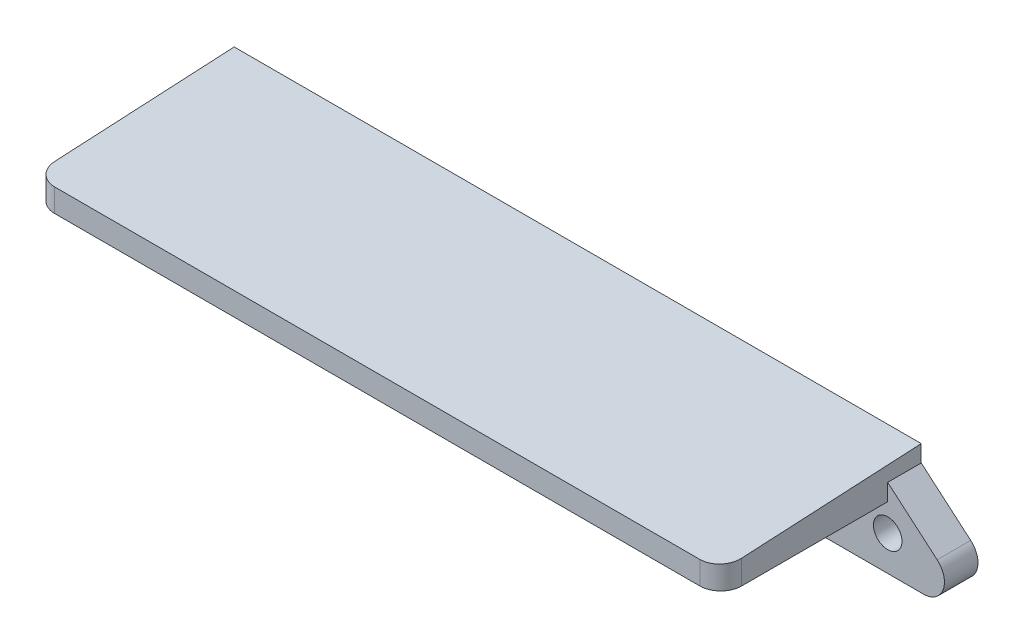
ISO-10303-21;
HEADER;
FILE_DESCRIPTION(('STEP AP214'),'2;1');
FILE_NAME('part.step','',(''),(''),'','','');
FILE_SCHEMA(('AUTOMOTIVE_DESIGN { 1 0 10303 214 1 1 1 1 }'));
ENDSEC;
DATA;
#1=APPLICATION_CONTEXT('core data for automotive mechanical design processes');
#2=APPLICATION_PROTOCOL_DEFINITION('international standard','automotive_design',2000,#1);
#3=PRODUCT_CONTEXT('',#1,'mechanical');
#4=PRODUCT('Part','Part','',(#3));
#5=PRODUCT_RELATED_PRODUCT_CATEGORY('part','',(#4));
#6=PRODUCT_DEFINITION_FORMATION('','',#4);
#7=PRODUCT_DEFINITION_CONTEXT('part definition',#1,'design');
#8=PRODUCT_DEFINITION('design','',#6,#7);
#9=PRODUCT_DEFINITION_SHAPE('','',#8);
#10=(LENGTH_UNIT() NAMED_UNIT(*) SI_UNIT(.MILLI.,.METRE.));
#11=(NAMED_UNIT(*) PLANE_ANGLE_UNIT() SI_UNIT($,.RADIAN.));
#12=(NAMED_UNIT(*) SI_UNIT($,.STERADIAN.) SOLID_ANGLE_UNIT());
#13=UNCERTAINTY_MEASURE_WITH_UNIT(LENGTH_MEASURE(1.E-05),#10,'distance_accuracy_value','');
#14=(GEOMETRIC_REPRESENTATION_CONTEXT(3) GLOBAL_UNCERTAINTY_ASSIGNED_CONTEXT((#13)) GLOBAL_UNIT_ASSIGNED_CONTEXT((#10,
#11,#12)) REPRESENTATION_CONTEXT('',''));
#15=CARTESIAN_POINT('',(0.,0.,0.));
#16=DIRECTION('',(0.,0.,1.));
#17=DIRECTION('',(1.,0.,0.));
#18=AXIS2_PLACEMENT_3D('',#15,#16,#17);
#19=CARTESIAN_POINT('',(40.95,11.4088057159238,4.));
#20=DIRECTION('',(-1.,0.,0.));
#21=DIRECTION('',(0.,-1.,0.));
#22=AXIS2_PLACEMENT_3D('',#19,#20,#21);
#23=PLANE('',#22);
#24=DIRECTION('',(0.,0.0523359562429439,-0.998629534754574));
#25=VECTOR('',#24,1.);
#26=CARTESIAN_POINT('',(40.95,11.4088057159238,0.));
#27=LINE('',#26,#25);
#28=CARTESIAN_POINT('',(40.95,10.2872792392667,21.4));
#29=VERTEX_POINT('',#28);
#30=CARTESIAN_POINT('',(40.95,11.4088057159238,0.));
#31=VERTEX_POINT('',#30);
#32=EDGE_CURVE('E130',#29,#31,#27,.T.);
#33=ORIENTED_EDGE('',*,*,#32,.F.);
#34=DIRECTION('',(0.,1.,0.));
#35=VECTOR('',#34,1.);
#36=CARTESIAN_POINT('',(40.95,7.40880571592377,21.4));
#37=LINE('',#36,#35);
#38=CARTESIAN_POINT('',(40.95,7.40880571592377,21.4));
#39=VERTEX_POINT('',#38);
#40=EDGE_CURVE('E202',#29,#39,#37,.F.);
#41=ORIENTED_EDGE('',*,*,#40,.T.);
#42=DIRECTION('',(0.,0.,-1.));
#43=VECTOR('',#42,1.);
#44=CARTESIAN_POINT('',(40.95,7.40880571592377,23.9));
#45=LINE('',#44,#43);
#46=CARTESIAN_POINT('',(40.95,7.40880571592377,4.));
#47=VERTEX_POINT('',#46);
#48=EDGE_CURVE('E230',#39,#47,#45,.T.);
#49=ORIENTED_EDGE('',*,*,#48,.T.);
#50=DIRECTION('',(0.,1.,0.));
#51=VECTOR('',#50,1.);
#52=CARTESIAN_POINT('',(40.95,11.4088057159238,4.));
#53=LINE('',#52,#51);
#54=CARTESIAN_POINT('',(40.95,9.40880571592378,4.));
#55=VERTEX_POINT('',#54);
#56=EDGE_CURVE('E231',#47,#55,#53,.T.);
#57=ORIENTED_EDGE('',*,*,#56,.T.);
#58=DIRECTION('',(0.,0.,-1.));
#59=VECTOR('',#58,1.);
#60=CARTESIAN_POINT('',(40.95,9.40880571592378,4.));
#61=LINE('',#60,#59);
#62=CARTESIAN_POINT('',(40.95,9.40880571592378,0.));
#63=VERTEX_POINT('',#62);
#64=EDGE_CURVE('E155',#55,#63,#61,.T.);
#65=ORIENTED_EDGE('',*,*,#64,.T.);
#66=DIRECTION('',(0.,-1.,0.));
#67=VECTOR('',#66,1.);
#68=CARTESIAN_POINT('',(40.95,11.4088057159238,0.));
#69=LINE('',#68,#67);
#70=EDGE_CURVE('E146',#31,#63,#69,.T.);
#71=ORIENTED_EDGE('',*,*,#70,.F.);
#72=EDGE_LOOP('',(#33,#41,#49,#57,#65,#71));
#73=FACE_BOUND('',#72,.T.);
#74=ADVANCED_FACE('F41',(#73),#23,.F.);
#75=CARTESIAN_POINT('',(-40.95,11.4088057159238,0.));
#76=DIRECTION('',(1.,0.,0.));
#77=DIRECTION('',(0.,1.,0.));
#78=AXIS2_PLACEMENT_3D('',#75,#76,#77);
#79=PLANE('',#78);
#80=DIRECTION('',(0.,-0.0523359562429439,0.998629534754574));
#81=VECTOR('',#80,1.);
#82=CARTESIAN_POINT('',(-40.95,11.4088057159238,0.));
#83=LINE('',#82,#81);
#84=CARTESIAN_POINT('',(-40.95,11.4088057159238,0.));
#85=VERTEX_POINT('',#84);
#86=CARTESIAN_POINT('',(-40.95,10.2872792392667,21.4));
#87=VERTEX_POINT('',#86);
#88=EDGE_CURVE('E58',#85,#87,#83,.T.);
#89=ORIENTED_EDGE('',*,*,#88,.F.);
#90=DIRECTION('',(0.,-1.,0.));
#91=VECTOR('',#90,1.);
#92=CARTESIAN_POINT('',(-40.95,11.4088057159238,0.));
#93=LINE('',#92,#91);
#94=CARTESIAN_POINT('',(-40.95,9.40880571592378,0.));
#95=VERTEX_POINT('',#94);
#96=EDGE_CURVE('E150',#85,#95,#93,.T.);
#97=ORIENTED_EDGE('',*,*,#96,.T.);
#98=DIRECTION('',(0.,0.,-1.));
#99=VECTOR('',#98,1.);
#100=CARTESIAN_POINT('',(-40.95,9.40880571592378,4.));
#101=LINE('',#100,#99);
#102=CARTESIAN_POINT('',(-40.95,9.40880571592378,4.));
#103=VERTEX_POINT('',#102);
#104=EDGE_CURVE('E170',#103,#95,#101,.T.);
#105=ORIENTED_EDGE('',*,*,#104,.F.);
#106=DIRECTION('',(0.,-1.,0.));
#107=VECTOR('',#106,1.);
#108=CARTESIAN_POINT('',(-40.95,11.4088057159238,4.));
#109=LINE('',#108,#107);
#110=CARTESIAN_POINT('',(-40.95,7.40880571592377,4.));
#111=VERTEX_POINT('',#110);
#112=EDGE_CURVE('E196',#103,#111,#109,.T.);
#113=ORIENTED_EDGE('',*,*,#112,.T.);
#114=DIRECTION('',(0.,0.,-1.));
#115=VECTOR('',#114,1.);
#116=CARTESIAN_POINT('',(-40.95,7.40880571592377,23.9));
#117=LINE('',#116,#115);
#118=CARTESIAN_POINT('',(-40.95,7.40880571592377,21.4));
#119=VERTEX_POINT('',#118);
#120=EDGE_CURVE('E151',#119,#111,#117,.T.);
#121=ORIENTED_EDGE('',*,*,#120,.F.);
#122=DIRECTION('',(0.,-1.,0.));
#123=VECTOR('',#122,1.);
#124=CARTESIAN_POINT('',(-40.95,11.4088057159238,21.4));
#125=LINE('',#124,#123);
#126=EDGE_CURVE('E50',#119,#87,#125,.F.);
#127=ORIENTED_EDGE('',*,*,#126,.T.);
#128=EDGE_LOOP('',(#89,#97,#105,#113,#121,#127));
#129=FACE_BOUND('',#128,.T.);
#130=ADVANCED_FACE('F248',(#129),#79,.F.);
#131=CARTESIAN_POINT('',(0.,0.,23.9));
#132=DIRECTION('',(0.,0.,1.));
#133=DIRECTION('',(1.,0.,0.));
#134=AXIS2_PLACEMENT_3D('',#131,#132,#133);
#135=PLANE('',#134);
#136=DIRECTION('',(0.,1.,0.));
#137=VECTOR('',#136,1.);
#138=CARTESIAN_POINT('',(38.45,11.4088057159238,23.9));
#139=LINE('',#138,#137);
#140=CARTESIAN_POINT('',(38.45,7.40880571592377,23.9));
#141=VERTEX_POINT('',#140);
#142=CARTESIAN_POINT('',(38.45,10.1562597910591,23.9));
#143=VERTEX_POINT('',#142);
#144=EDGE_CURVE('E199',#141,#143,#139,.T.);
#145=ORIENTED_EDGE('',*,*,#144,.T.);
#146=DIRECTION('',(-1.,0.,0.));
#147=VECTOR('',#146,1.);
#148=CARTESIAN_POINT('',(0.,10.1562597910591,23.9));
#149=LINE('',#148,#147);
#150=CARTESIAN_POINT('',(-38.45,10.1562597910591,23.9));
#151=VERTEX_POINT('',#150);
#152=EDGE_CURVE('E139',#143,#151,#149,.T.);
#153=ORIENTED_EDGE('',*,*,#152,.T.);
#154=DIRECTION('',(0.,-1.,0.));
#155=VECTOR('',#154,1.);
#156=CARTESIAN_POINT('',(-38.45,7.40880571592377,23.9));
#157=LINE('',#156,#155);
#158=CARTESIAN_POINT('',(-38.45,7.40880571592377,23.9));
#159=VERTEX_POINT('',#158);
#160=EDGE_CURVE('E197',#151,#159,#157,.T.);
#161=ORIENTED_EDGE('',*,*,#160,.T.);
#162=DIRECTION('',(1.,0.,0.));
#163=VECTOR('',#162,1.);
#164=CARTESIAN_POINT('',(-40.95,7.40880571592377,23.9));
#165=LINE('',#164,#163);
#166=EDGE_CURVE('E227',#159,#141,#165,.T.);
#167=ORIENTED_EDGE('',*,*,#166,.T.);
#168=EDGE_LOOP('',(#145,#153,#161,#167));
#169=FACE_BOUND('',#168,.T.);
#170=ADVANCED_FACE('F273',(#169),#135,.T.);
#171=CARTESIAN_POINT('',(38.45,0.,21.4));
#172=DIRECTION('',(0.,-1.,0.));
#173=DIRECTION('',(1.,0.,0.));
#174=AXIS2_PLACEMENT_3D('',#171,#172,#173);
#175=CYLINDRICAL_SURFACE('',#174,2.5);
#176=ORIENTED_EDGE('',*,*,#40,.F.);
#177=CARTESIAN_POINT('',(38.45,10.2872792392667,21.4));
#178=DIRECTION('',(0.,0.998629534754574,0.0523359562429439));
#179=DIRECTION('',(0.,-0.052335956242944,0.998629534754574));
#180=AXIS2_PLACEMENT_3D('',#177,#178,#179);
#181=ELLIPSE('',#180,2.5034308649948,2.5);
#182=EDGE_CURVE('E135',#29,#143,#181,.F.);
#183=ORIENTED_EDGE('',*,*,#182,.T.);
#184=ORIENTED_EDGE('',*,*,#144,.F.);
#185=CARTESIAN_POINT('',(38.45,7.40880571592377,21.4));
#186=DIRECTION('',(0.,1.,0.));
#187=DIRECTION('',(0.,0.,1.));
#188=AXIS2_PLACEMENT_3D('',#185,#186,#187);
#189=CIRCLE('',#188,2.5);
#190=EDGE_CURVE('E205',#39,#141,#189,.F.);
#191=ORIENTED_EDGE('',*,*,#190,.F.);
#192=EDGE_LOOP('',(#176,#183,#184,#191));
#193=FACE_BOUND('',#192,.T.);
#194=ADVANCED_FACE('F271',(#193),#175,.T.);
#195=CARTESIAN_POINT('',(-38.45,0.,21.4));
#196=DIRECTION('',(0.,1.,0.));
#197=DIRECTION('',(-1.,0.,0.));
#198=AXIS2_PLACEMENT_3D('',#195,#196,#197);
#199=CYLINDRICAL_SURFACE('',#198,2.5);
#200=ORIENTED_EDGE('',*,*,#160,.F.);
#201=CARTESIAN_POINT('',(-38.45,10.2872792392667,21.4));
#202=DIRECTION('',(0.,0.998629534754574,0.0523359562429439));
#203=DIRECTION('',(0.,0.052335956242944,-0.998629534754574));
#204=AXIS2_PLACEMENT_3D('',#201,#202,#203);
#205=ELLIPSE('',#204,2.5034308649948,2.5);
#206=EDGE_CURVE('E11',#151,#87,#205,.F.);
#207=ORIENTED_EDGE('',*,*,#206,.T.);
#208=ORIENTED_EDGE('',*,*,#126,.F.);
#209=CARTESIAN_POINT('',(-38.45,7.40880571592377,21.4));
#210=DIRECTION('',(0.,1.,0.));
#211=DIRECTION('',(0.,0.,1.));
#212=AXIS2_PLACEMENT_3D('',#209,#210,#211);
#213=CIRCLE('',#212,2.5);
#214=EDGE_CURVE('E65',#159,#119,#213,.F.);
#215=ORIENTED_EDGE('',*,*,#214,.F.);
#216=EDGE_LOOP('',(#200,#207,#208,#215));
#217=FACE_BOUND('',#216,.T.);
#218=ADVANCED_FACE('F43',(#217),#199,.T.);
#219=CARTESIAN_POINT('',(0.,0.,4.));
#220=DIRECTION('',(0.,0.,-1.));
#221=DIRECTION('',(-1.,0.,0.));
#222=AXIS2_PLACEMENT_3D('',#219,#220,#221);
#223=PLANE('',#222);
#224=CARTESIAN_POINT('',(40.95,4.15880571592378,4.));
#225=DIRECTION('',(0.,0.,-1.));
#226=DIRECTION('',(-1.,0.,0.));
#227=AXIS2_PLACEMENT_3D('',#224,#225,#226);
#228=CIRCLE('',#227,1.7);
#229=CARTESIAN_POINT('',(39.25,4.15880571592378,4.));
#230=VERTEX_POINT('',#229);
#231=EDGE_CURVE('E45',#230,#230,#228,.T.);
#232=ORIENTED_EDGE('',*,*,#231,.T.);
#233=EDGE_LOOP('',(#232));
#234=FACE_BOUND('',#233,.T.);
#235=CARTESIAN_POINT('',(-40.95,4.15880571592378,4.));
#236=DIRECTION('',(0.,0.,-1.));
#237=DIRECTION('',(-1.,0.,0.));
#238=AXIS2_PLACEMENT_3D('',#235,#236,#237);
#239=CIRCLE('',#238,1.7);
#240=CARTESIAN_POINT('',(-42.65,4.15880571592378,4.));
#241=VERTEX_POINT('',#240);
#242=EDGE_CURVE('E208',#241,#241,#239,.T.);
#243=ORIENTED_EDGE('',*,*,#242,.T.);
#244=EDGE_LOOP('',(#243));
#245=FACE_BOUND('',#244,.T.);
#246=ORIENTED_EDGE('',*,*,#112,.F.);
#247=DIRECTION('',(-0.75993091537133,-0.650003849113905,0.));
#248=VECTOR('',#247,1.);
#249=CARTESIAN_POINT('',(-51.95,0.,4.));
#250=LINE('',#249,#248);
#251=CARTESIAN_POINT('',(-46.8472359701216,4.3646286701209,4.));
#252=VERTEX_POINT('',#251);
#253=EDGE_CURVE('E164',#103,#252,#250,.T.);
#254=ORIENTED_EDGE('',*,*,#253,.T.);
#255=CARTESIAN_POINT('',(-45.2352264243191,2.48,4.));
#256=DIRECTION('',(0.,0.,-1.));
#257=DIRECTION('',(-1.,0.,0.));
#258=AXIS2_PLACEMENT_3D('',#255,#256,#257);
#259=CIRCLE('',#258,2.48);
#260=CARTESIAN_POINT('',(-45.2352264243191,0.,4.));
#261=VERTEX_POINT('',#260);
#262=EDGE_CURVE('E190',#252,#261,#259,.F.);
#263=ORIENTED_EDGE('',*,*,#262,.T.);
#264=DIRECTION('',(1.,0.,0.));
#265=VECTOR('',#264,1.);
#266=CARTESIAN_POINT('',(-51.95,0.,4.));
#267=LINE('',#266,#265);
#268=CARTESIAN_POINT('',(45.2352264243191,0.,4.));
#269=VERTEX_POINT('',#268);
#270=EDGE_CURVE('E168',#261,#269,#267,.T.);
#271=ORIENTED_EDGE('',*,*,#270,.T.);
#272=CARTESIAN_POINT('',(45.2352264243191,2.48,4.));
#273=DIRECTION('',(0.,0.,-1.));
#274=DIRECTION('',(-1.,0.,0.));
#275=AXIS2_PLACEMENT_3D('',#272,#273,#274);
#276=CIRCLE('',#275,2.48);
#277=CARTESIAN_POINT('',(46.8472359701216,4.3646286701209,4.));
#278=VERTEX_POINT('',#277);
#279=EDGE_CURVE('E192',#269,#278,#276,.F.);
#280=ORIENTED_EDGE('',*,*,#279,.T.);
#281=DIRECTION('',(-0.75993091537133,0.650003849113905,0.));
#282=VECTOR('',#281,1.);
#283=CARTESIAN_POINT('',(51.95,0.,4.));
#284=LINE('',#283,#282);
#285=EDGE_CURVE('E162',#278,#55,#284,.T.);
#286=ORIENTED_EDGE('',*,*,#285,.T.);
#287=ORIENTED_EDGE('',*,*,#56,.F.);
#288=DIRECTION('',(1.,0.,0.));
#289=VECTOR('',#288,1.);
#290=CARTESIAN_POINT('',(-40.95,7.40880571592377,4.));
#291=LINE('',#290,#289);
#292=EDGE_CURVE('E226',#111,#47,#291,.T.);
#293=ORIENTED_EDGE('',*,*,#292,.F.);
#294=EDGE_LOOP('',(#246,#254,#263,#271,#280,#286,#287,#293));
#295=FACE_BOUND('',#294,.T.);
#296=ADVANCED_FACE('F245',(#234,#245,#295),#223,.F.);
#297=CARTESIAN_POINT('',(51.95,0.,4.));
#298=DIRECTION('',(-0.650003849113905,-0.75993091537133,0.));
#299=DIRECTION('',(0.75993091537133,-0.650003849113905,0.));
#300=AXIS2_PLACEMENT_3D('',#297,#298,#299);
#301=PLANE('',#300);
#302=ORIENTED_EDGE('',*,*,#285,.F.);
#303=DIRECTION('',(0.,0.,-1.));
#304=VECTOR('',#303,1.);
#305=CARTESIAN_POINT('',(46.8472359701216,4.3646286701209,4.));
#306=LINE('',#305,#304);
#307=CARTESIAN_POINT('',(46.8472359701216,4.3646286701209,0.));
#308=VERTEX_POINT('',#307);
#309=EDGE_CURVE('E178',#278,#308,#306,.T.);
#310=ORIENTED_EDGE('',*,*,#309,.T.);
#311=DIRECTION('',(-0.75993091537133,0.650003849113905,0.));
#312=VECTOR('',#311,1.);
#313=CARTESIAN_POINT('',(51.95,0.,0.));
#314=LINE('',#313,#312);
#315=EDGE_CURVE('E156',#308,#63,#314,.T.);
#316=ORIENTED_EDGE('',*,*,#315,.T.);
#317=ORIENTED_EDGE('',*,*,#64,.F.);
#318=EDGE_LOOP('',(#302,#310,#316,#317));
#319=FACE_BOUND('',#318,.T.);
#320=ADVANCED_FACE('F267',(#319),#301,.F.);
#321=CARTESIAN_POINT('',(-51.95,0.,4.));
#322=DIRECTION('',(0.650003849113905,-0.75993091537133,0.));
#323=DIRECTION('',(0.75993091537133,0.650003849113905,0.));
#324=AXIS2_PLACEMENT_3D('',#321,#322,#323);
#325=PLANE('',#324);
#326=DIRECTION('',(-0.75993091537133,-0.650003849113905,0.));
#327=VECTOR('',#326,1.);
#328=CARTESIAN_POINT('',(-51.95,0.,0.));
#329=LINE('',#328,#327);
#330=CARTESIAN_POINT('',(-46.8472359701216,4.3646286701209,0.));
#331=VERTEX_POINT('',#330);
#332=EDGE_CURVE('E158',#95,#331,#329,.T.);
#333=ORIENTED_EDGE('',*,*,#332,.T.);
#334=DIRECTION('',(0.,0.,-1.));
#335=VECTOR('',#334,1.);
#336=CARTESIAN_POINT('',(-46.8472359701216,4.3646286701209,4.));
#337=LINE('',#336,#335);
#338=EDGE_CURVE('E194',#331,#252,#337,.F.);
#339=ORIENTED_EDGE('',*,*,#338,.T.);
#340=ORIENTED_EDGE('',*,*,#253,.F.);
#341=ORIENTED_EDGE('',*,*,#104,.T.);
#342=EDGE_LOOP('',(#333,#339,#340,#341));
#343=FACE_BOUND('',#342,.T.);
#344=ADVANCED_FACE('F250',(#343),#325,.F.);
#345=CARTESIAN_POINT('',(-51.95,0.,4.));
#346=DIRECTION('',(0.,1.,0.));
#347=DIRECTION('',(0.,0.,1.));
#348=AXIS2_PLACEMENT_3D('',#345,#346,#347);
#349=PLANE('',#348);
#350=DIRECTION('',(1.,0.,0.));
#351=VECTOR('',#350,1.);
#352=CARTESIAN_POINT('',(-51.95,0.,0.));
#353=LINE('',#352,#351);
#354=CARTESIAN_POINT('',(-45.2352264243191,0.,0.));
#355=VERTEX_POINT('',#354);
#356=CARTESIAN_POINT('',(45.2352264243191,0.,0.));
#357=VERTEX_POINT('',#356);
#358=EDGE_CURVE('E165',#355,#357,#353,.T.);
#359=ORIENTED_EDGE('',*,*,#358,.T.);
#360=DIRECTION('',(0.,0.,-1.));
#361=VECTOR('',#360,1.);
#362=CARTESIAN_POINT('',(45.2352264243191,0.,4.));
#363=LINE('',#362,#361);
#364=EDGE_CURVE('E188',#357,#269,#363,.F.);
#365=ORIENTED_EDGE('',*,*,#364,.T.);
#366=ORIENTED_EDGE('',*,*,#270,.F.);
#367=DIRECTION('',(0.,0.,-1.));
#368=VECTOR('',#367,1.);
#369=CARTESIAN_POINT('',(-45.2352264243191,0.,4.));
#370=LINE('',#369,#368);
#371=EDGE_CURVE('E185',#261,#355,#370,.T.);
#372=ORIENTED_EDGE('',*,*,#371,.T.);
#373=EDGE_LOOP('',(#359,#365,#366,#372));
#374=FACE_BOUND('',#373,.T.);
#375=ADVANCED_FACE('F259',(#374),#349,.F.);
#376=CARTESIAN_POINT('',(0.,0.,0.));
#377=DIRECTION('',(0.,0.,-1.));
#378=DIRECTION('',(-1.,0.,0.));
#379=AXIS2_PLACEMENT_3D('',#376,#377,#378);
#380=PLANE('',#379);
#381=CARTESIAN_POINT('',(40.95,4.15880571592378,0.));
#382=DIRECTION('',(0.,0.,-1.));
#383=DIRECTION('',(-1.,0.,0.));
#384=AXIS2_PLACEMENT_3D('',#381,#382,#383);
#385=CIRCLE('',#384,3.15);
#386=CARTESIAN_POINT('',(37.8,4.15880571592378,0.));
#387=VERTEX_POINT('',#386);
#388=EDGE_CURVE('E335',#387,#387,#385,.T.);
#389=ORIENTED_EDGE('',*,*,#388,.F.);
#390=EDGE_LOOP('',(#389));
#391=FACE_BOUND('',#390,.T.);
#392=CARTESIAN_POINT('',(-40.95,4.15880571592378,0.));
#393=DIRECTION('',(0.,0.,-1.));
#394=DIRECTION('',(-1.,0.,0.));
#395=AXIS2_PLACEMENT_3D('',#392,#393,#394);
#396=CIRCLE('',#395,3.15);
#397=CARTESIAN_POINT('',(-44.1,4.15880571592378,0.));
#398=VERTEX_POINT('',#397);
#399=EDGE_CURVE('E215',#398,#398,#396,.T.);
#400=ORIENTED_EDGE('',*,*,#399,.F.);
#401=EDGE_LOOP('',(#400));
#402=FACE_BOUND('',#401,.T.);
#403=ORIENTED_EDGE('',*,*,#315,.F.);
#404=CARTESIAN_POINT('',(45.2352264243191,2.48,0.));
#405=DIRECTION('',(0.,0.,-1.));
#406=DIRECTION('',(-1.,0.,0.));
#407=AXIS2_PLACEMENT_3D('',#404,#405,#406);
#408=CIRCLE('',#407,2.48);
#409=EDGE_CURVE('E183',#308,#357,#408,.T.);
#410=ORIENTED_EDGE('',*,*,#409,.T.);
#411=ORIENTED_EDGE('',*,*,#358,.F.);
#412=CARTESIAN_POINT('',(-45.2352264243191,2.48,0.));
#413=DIRECTION('',(0.,0.,-1.));
#414=DIRECTION('',(-1.,0.,0.));
#415=AXIS2_PLACEMENT_3D('',#412,#413,#414);
#416=CIRCLE('',#415,2.48);
#417=EDGE_CURVE('E181',#355,#331,#416,.T.);
#418=ORIENTED_EDGE('',*,*,#417,.T.);
#419=ORIENTED_EDGE('',*,*,#332,.F.);
#420=ORIENTED_EDGE('',*,*,#96,.F.);
#421=DIRECTION('',(-1.,0.,0.));
#422=VECTOR('',#421,1.);
#423=CARTESIAN_POINT('',(40.95,11.4088057159238,0.));
#424=LINE('',#423,#422);
#425=EDGE_CURVE('E133',#31,#85,#424,.T.);
#426=ORIENTED_EDGE('',*,*,#425,.F.);
#427=ORIENTED_EDGE('',*,*,#70,.T.);
#428=EDGE_LOOP('',(#403,#410,#411,#418,#419,#420,#426,#427));
#429=FACE_BOUND('',#428,.T.);
#430=ADVANCED_FACE('F145',(#391,#402,#429),#380,.T.);
#431=CARTESIAN_POINT('',(45.2352264243191,2.48,4.));
#432=DIRECTION('',(0.,0.,-1.));
#433=DIRECTION('',(-1.,0.,0.));
#434=AXIS2_PLACEMENT_3D('',#431,#432,#433);
#435=CYLINDRICAL_SURFACE('',#434,2.48);
#436=ORIENTED_EDGE('',*,*,#279,.F.);
#437=ORIENTED_EDGE('',*,*,#364,.F.);
#438=ORIENTED_EDGE('',*,*,#409,.F.);
#439=ORIENTED_EDGE('',*,*,#309,.F.);
#440=EDGE_LOOP('',(#436,#437,#438,#439));
#441=FACE_BOUND('',#440,.T.);
#442=ADVANCED_FACE('F265',(#441),#435,.T.);
#443=CARTESIAN_POINT('',(-45.2352264243191,2.48,4.));
#444=DIRECTION('',(0.,0.,-1.));
#445=DIRECTION('',(-1.,0.,0.));
#446=AXIS2_PLACEMENT_3D('',#443,#444,#445);
#447=CYLINDRICAL_SURFACE('',#446,2.48);
#448=ORIENTED_EDGE('',*,*,#262,.F.);
#449=ORIENTED_EDGE('',*,*,#338,.F.);
#450=ORIENTED_EDGE('',*,*,#417,.F.);
#451=ORIENTED_EDGE('',*,*,#371,.F.);
#452=EDGE_LOOP('',(#448,#449,#450,#451));
#453=FACE_BOUND('',#452,.T.);
#454=ADVANCED_FACE('F256',(#453),#447,.T.);
#455=CARTESIAN_POINT('',(-40.95,7.40880571592377,23.9));
#456=DIRECTION('',(0.,1.,0.));
#457=DIRECTION('',(0.,0.,1.));
#458=AXIS2_PLACEMENT_3D('',#455,#456,#457);
#459=PLANE('',#458);
#460=ORIENTED_EDGE('',*,*,#48,.F.);
#461=ORIENTED_EDGE('',*,*,#190,.T.);
#462=ORIENTED_EDGE('',*,*,#166,.F.);
#463=ORIENTED_EDGE('',*,*,#214,.T.);
#464=ORIENTED_EDGE('',*,*,#120,.T.);
#465=ORIENTED_EDGE('',*,*,#292,.T.);
#466=EDGE_LOOP('',(#460,#461,#462,#463,#464,#465));
#467=FACE_BOUND('',#466,.T.);
#468=ADVANCED_FACE('F240',(#467),#459,.F.);
#469=CARTESIAN_POINT('',(0.,11.4088057159238,0.));
#470=DIRECTION('',(0.,0.998629534754574,0.0523359562429439));
#471=DIRECTION('',(-1.,0.,0.));
#472=AXIS2_PLACEMENT_3D('',#469,#470,#471);
#473=PLANE('',#472);
#474=ORIENTED_EDGE('',*,*,#32,.T.);
#475=ORIENTED_EDGE('',*,*,#425,.T.);
#476=ORIENTED_EDGE('',*,*,#88,.T.);
#477=ORIENTED_EDGE('',*,*,#206,.F.);
#478=ORIENTED_EDGE('',*,*,#152,.F.);
#479=ORIENTED_EDGE('',*,*,#182,.F.);
#480=EDGE_LOOP('',(#474,#475,#476,#477,#478,#479));
#481=FACE_BOUND('',#480,.T.);
#482=ADVANCED_FACE('F132',(#481),#473,.T.);
#483=CARTESIAN_POINT('',(-40.95,4.15880571592378,0.));
#484=DIRECTION('',(0.,0.,-1.));
#485=DIRECTION('',(-1.,0.,0.));
#486=AXIS2_PLACEMENT_3D('',#483,#484,#485);
#487=CYLINDRICAL_SURFACE('',#486,1.7);
#488=CARTESIAN_POINT('',(-40.95,4.15880571592378,1.45));
#489=DIRECTION('',(0.,0.,-1.));
#490=DIRECTION('',(-1.,0.,0.));
#491=AXIS2_PLACEMENT_3D('',#488,#489,#490);
#492=CIRCLE('',#491,1.7);
#493=CARTESIAN_POINT('',(-42.65,4.15880571592378,1.45));
#494=VERTEX_POINT('',#493);
#495=EDGE_CURVE('E210',#494,#494,#492,.T.);
#496=ORIENTED_EDGE('',*,*,#495,.T.);
#497=EDGE_LOOP('',(#496));
#498=FACE_BOUND('',#497,.T.);
#499=ORIENTED_EDGE('',*,*,#242,.F.);
#500=EDGE_LOOP('',(#499));
#501=FACE_BOUND('',#500,.T.);
#502=ADVANCED_FACE('F309',(#498,#501),#487,.F.);
#503=CARTESIAN_POINT('',(-40.95,4.15880571592378,0.));
#504=DIRECTION('',(0.,0.,-1.));
#505=DIRECTION('',(-1.,0.,0.));
#506=AXIS2_PLACEMENT_3D('',#503,#504,#505);
#507=CONICAL_SURFACE('',#506,3.15,0.785398163397448);
#508=ORIENTED_EDGE('',*,*,#495,.F.);
#509=EDGE_LOOP('',(#508));
#510=FACE_BOUND('',#509,.T.);
#511=ORIENTED_EDGE('',*,*,#399,.T.);
#512=EDGE_LOOP('',(#511));
#513=FACE_BOUND('',#512,.T.);
#514=ADVANCED_FACE('F316',(#510,#513),#507,.F.);
#515=CARTESIAN_POINT('',(40.95,4.15880571592378,0.));
#516=DIRECTION('',(0.,0.,-1.));
#517=DIRECTION('',(-1.,0.,0.));
#518=AXIS2_PLACEMENT_3D('',#515,#516,#517);
#519=CYLINDRICAL_SURFACE('',#518,1.7);
#520=CARTESIAN_POINT('',(40.95,4.15880571592378,1.45));
#521=DIRECTION('',(0.,0.,-1.));
#522=DIRECTION('',(-1.,0.,0.));
#523=AXIS2_PLACEMENT_3D('',#520,#521,#522);
#524=CIRCLE('',#523,1.7);
#525=CARTESIAN_POINT('',(39.25,4.15880571592378,1.45));
#526=VERTEX_POINT('',#525);
#527=EDGE_CURVE('E332',#526,#526,#524,.T.);
#528=ORIENTED_EDGE('',*,*,#527,.T.);
#529=EDGE_LOOP('',(#528));
#530=FACE_BOUND('',#529,.T.);
#531=ORIENTED_EDGE('',*,*,#231,.F.);
#532=EDGE_LOOP('',(#531));
#533=FACE_BOUND('',#532,.T.);
#534=ADVANCED_FACE('F319',(#530,#533),#519,.F.);
#535=CARTESIAN_POINT('',(40.95,4.15880571592378,0.));
#536=DIRECTION('',(0.,0.,-1.));
#537=DIRECTION('',(-1.,0.,0.));
#538=AXIS2_PLACEMENT_3D('',#535,#536,#537);
#539=CONICAL_SURFACE('',#538,3.15,0.785398163397448);
#540=ORIENTED_EDGE('',*,*,#527,.F.);
#541=EDGE_LOOP('',(#540));
#542=FACE_BOUND('',#541,.T.);
#543=ORIENTED_EDGE('',*,*,#388,.T.);
#544=EDGE_LOOP('',(#543));
#545=FACE_BOUND('',#544,.T.);
#546=ADVANCED_FACE('F323',(#542,#545),#539,.F.);
#547=CLOSED_SHELL('',(#74,#130,#170,#194,#218,#296,#320,#344,#375,#430,#442,#454,#468,#482,#502,
#514,#534,#546));
#548=MANIFOLD_SOLID_BREP('B2',#547);
#549=ADVANCED_BREP_SHAPE_REPRESENTATION('',(#18,#548),#14);
#550=SHAPE_DEFINITION_REPRESENTATION(#9,#549);
ENDSEC;
END-ISO-10303-21;
